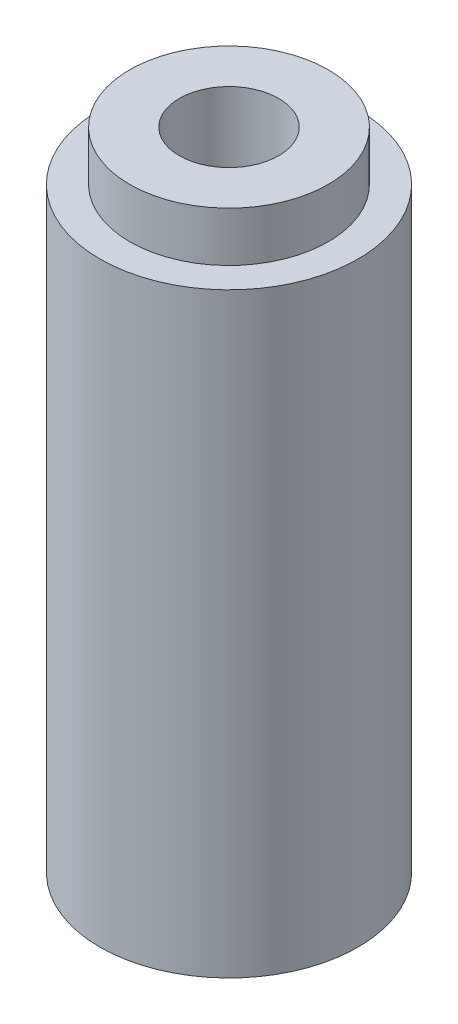
ISO-10303-21;
HEADER;
FILE_DESCRIPTION(('STEP AP214'),'2;1');
FILE_NAME('part.step','',(''),(''),'','','');
FILE_SCHEMA(('AUTOMOTIVE_DESIGN { 1 0 10303 214 1 1 1 1 }'));
ENDSEC;
DATA;
#1=APPLICATION_CONTEXT('core data for automotive mechanical design processes');
#2=APPLICATION_PROTOCOL_DEFINITION('international standard','automotive_design',2000,#1);
#3=PRODUCT_CONTEXT('',#1,'mechanical');
#4=PRODUCT('Part','Part','',(#3));
#5=PRODUCT_RELATED_PRODUCT_CATEGORY('part','',(#4));
#6=PRODUCT_DEFINITION_FORMATION('','',#4);
#7=PRODUCT_DEFINITION_CONTEXT('part definition',#1,'design');
#8=PRODUCT_DEFINITION('design','',#6,#7);
#9=PRODUCT_DEFINITION_SHAPE('','',#8);
#10=(LENGTH_UNIT() NAMED_UNIT(*) SI_UNIT(.MILLI.,.METRE.));
#11=(NAMED_UNIT(*) PLANE_ANGLE_UNIT() SI_UNIT($,.RADIAN.));
#12=(NAMED_UNIT(*) SI_UNIT($,.STERADIAN.) SOLID_ANGLE_UNIT());
#13=UNCERTAINTY_MEASURE_WITH_UNIT(LENGTH_MEASURE(1.E-05),#10,'distance_accuracy_value','');
#14=(GEOMETRIC_REPRESENTATION_CONTEXT(3) GLOBAL_UNCERTAINTY_ASSIGNED_CONTEXT((#13)) GLOBAL_UNIT_ASSIGNED_CONTEXT((#10,
#11,#12)) REPRESENTATION_CONTEXT('',''));
#15=CARTESIAN_POINT('',(0.,0.,0.));
#16=DIRECTION('',(0.,0.,1.));
#17=DIRECTION('',(1.,0.,0.));
#18=AXIS2_PLACEMENT_3D('',#15,#16,#17);
#19=CARTESIAN_POINT('',(0.,12.,0.));
#20=DIRECTION('',(0.,1.,0.));
#21=DIRECTION('',(0.,0.,1.));
#22=AXIS2_PLACEMENT_3D('',#19,#20,#21);
#23=PLANE('',#22);
#24=CARTESIAN_POINT('',(0.,12.,0.));
#25=DIRECTION('',(0.,1.,0.));
#26=DIRECTION('',(0.,0.,1.));
#27=AXIS2_PLACEMENT_3D('',#24,#25,#26);
#28=CIRCLE('',#27,2.);
#29=CARTESIAN_POINT('',(0.,12.,2.));
#30=VERTEX_POINT('',#29);
#31=EDGE_CURVE('E10',#30,#30,#28,.T.);
#32=ORIENTED_EDGE('',*,*,#31,.F.);
#33=EDGE_LOOP('',(#32));
#34=FACE_BOUND('',#33,.T.);
#35=CARTESIAN_POINT('',(0.,12.,0.));
#36=DIRECTION('',(0.,1.,0.));
#37=DIRECTION('',(0.,0.,1.));
#38=AXIS2_PLACEMENT_3D('',#35,#36,#37);
#39=CIRCLE('',#38,2.6);
#40=CARTESIAN_POINT('',(0.,12.,2.6));
#41=VERTEX_POINT('',#40);
#42=EDGE_CURVE('E46',#41,#41,#39,.T.);
#43=ORIENTED_EDGE('',*,*,#42,.T.);
#44=EDGE_LOOP('',(#43));
#45=FACE_BOUND('',#44,.T.);
#46=ADVANCED_FACE('F37',(#34,#45),#23,.T.);
#47=CARTESIAN_POINT('',(0.,0.,0.));
#48=DIRECTION('',(0.,1.,0.));
#49=DIRECTION('',(0.,0.,1.));
#50=AXIS2_PLACEMENT_3D('',#47,#48,#49);
#51=PLANE('',#50);
#52=CARTESIAN_POINT('',(0.,0.,0.));
#53=DIRECTION('',(0.,1.,0.));
#54=DIRECTION('',(0.,0.,1.));
#55=AXIS2_PLACEMENT_3D('',#52,#53,#54);
#56=CIRCLE('',#55,2.6);
#57=CARTESIAN_POINT('',(0.,0.,2.6));
#58=VERTEX_POINT('',#57);
#59=EDGE_CURVE('E41',#58,#58,#56,.T.);
#60=ORIENTED_EDGE('',*,*,#59,.F.);
#61=EDGE_LOOP('',(#60));
#62=FACE_BOUND('',#61,.T.);
#63=CARTESIAN_POINT('',(0.,0.,0.));
#64=DIRECTION('',(0.,1.,0.));
#65=DIRECTION('',(0.,0.,1.));
#66=AXIS2_PLACEMENT_3D('',#63,#64,#65);
#67=CIRCLE('',#66,1.);
#68=CARTESIAN_POINT('',(0.,0.,1.));
#69=VERTEX_POINT('',#68);
#70=EDGE_CURVE('E56',#69,#69,#67,.T.);
#71=ORIENTED_EDGE('',*,*,#70,.T.);
#72=EDGE_LOOP('',(#71));
#73=FACE_BOUND('',#72,.T.);
#74=ADVANCED_FACE('F87',(#62,#73),#51,.F.);
#75=CARTESIAN_POINT('',(0.,12.,0.));
#76=DIRECTION('',(0.,-1.,0.));
#77=DIRECTION('',(0.,0.,-1.));
#78=AXIS2_PLACEMENT_3D('',#75,#76,#77);
#79=CYLINDRICAL_SURFACE('',#78,2.6);
#80=ORIENTED_EDGE('',*,*,#42,.F.);
#81=EDGE_LOOP('',(#80));
#82=FACE_BOUND('',#81,.T.);
#83=ORIENTED_EDGE('',*,*,#59,.T.);
#84=EDGE_LOOP('',(#83));
#85=FACE_BOUND('',#84,.T.);
#86=ADVANCED_FACE('F39',(#82,#85),#79,.T.);
#87=CARTESIAN_POINT('',(0.,12.,0.));
#88=DIRECTION('',(0.,-1.,0.));
#89=DIRECTION('',(0.,0.,-1.));
#90=AXIS2_PLACEMENT_3D('',#87,#88,#89);
#91=CYLINDRICAL_SURFACE('',#90,1.);
#92=ORIENTED_EDGE('',*,*,#70,.F.);
#93=EDGE_LOOP('',(#92));
#94=FACE_BOUND('',#93,.T.);
#95=CARTESIAN_POINT('',(0.,13.,0.));
#96=DIRECTION('',(0.,1.,0.));
#97=DIRECTION('',(0.,0.,1.));
#98=AXIS2_PLACEMENT_3D('',#95,#96,#97);
#99=CIRCLE('',#98,1.);
#100=CARTESIAN_POINT('',(0.,13.,1.));
#101=VERTEX_POINT('',#100);
#102=EDGE_CURVE('E65',#101,#101,#99,.T.);
#103=ORIENTED_EDGE('',*,*,#102,.T.);
#104=EDGE_LOOP('',(#103));
#105=FACE_BOUND('',#104,.T.);
#106=ADVANCED_FACE('F72',(#94,#105),#91,.F.);
#107=CARTESIAN_POINT('',(0.,13.,0.));
#108=DIRECTION('',(0.,1.,0.));
#109=DIRECTION('',(0.,0.,1.));
#110=AXIS2_PLACEMENT_3D('',#107,#108,#109);
#111=PLANE('',#110);
#112=CARTESIAN_POINT('',(0.,13.,0.));
#113=DIRECTION('',(0.,1.,0.));
#114=DIRECTION('',(0.,0.,1.));
#115=AXIS2_PLACEMENT_3D('',#112,#113,#114);
#116=CIRCLE('',#115,2.);
#117=CARTESIAN_POINT('',(0.,13.,2.));
#118=VERTEX_POINT('',#117);
#119=EDGE_CURVE('E54',#118,#118,#116,.T.);
#120=ORIENTED_EDGE('',*,*,#119,.T.);
#121=EDGE_LOOP('',(#120));
#122=FACE_BOUND('',#121,.T.);
#123=ORIENTED_EDGE('',*,*,#102,.F.);
#124=EDGE_LOOP('',(#123));
#125=FACE_BOUND('',#124,.T.);
#126=ADVANCED_FACE('F74',(#122,#125),#111,.T.);
#127=CARTESIAN_POINT('',(0.,13.,0.));
#128=DIRECTION('',(0.,-1.,0.));
#129=DIRECTION('',(0.,0.,-1.));
#130=AXIS2_PLACEMENT_3D('',#127,#128,#129);
#131=CYLINDRICAL_SURFACE('',#130,2.);
#132=ORIENTED_EDGE('',*,*,#119,.F.);
#133=EDGE_LOOP('',(#132));
#134=FACE_BOUND('',#133,.T.);
#135=ORIENTED_EDGE('',*,*,#31,.T.);
#136=EDGE_LOOP('',(#135));
#137=FACE_BOUND('',#136,.T.);
#138=ADVANCED_FACE('F76',(#134,#137),#131,.T.);
#139=CLOSED_SHELL('',(#46,#74,#86,#106,#126,#138));
#140=MANIFOLD_SOLID_BREP('B2',#139);
#141=ADVANCED_BREP_SHAPE_REPRESENTATION('',(#18,#140),#14);
#142=SHAPE_DEFINITION_REPRESENTATION(#9,#141);
ENDSEC;
END-ISO-10303-21;
